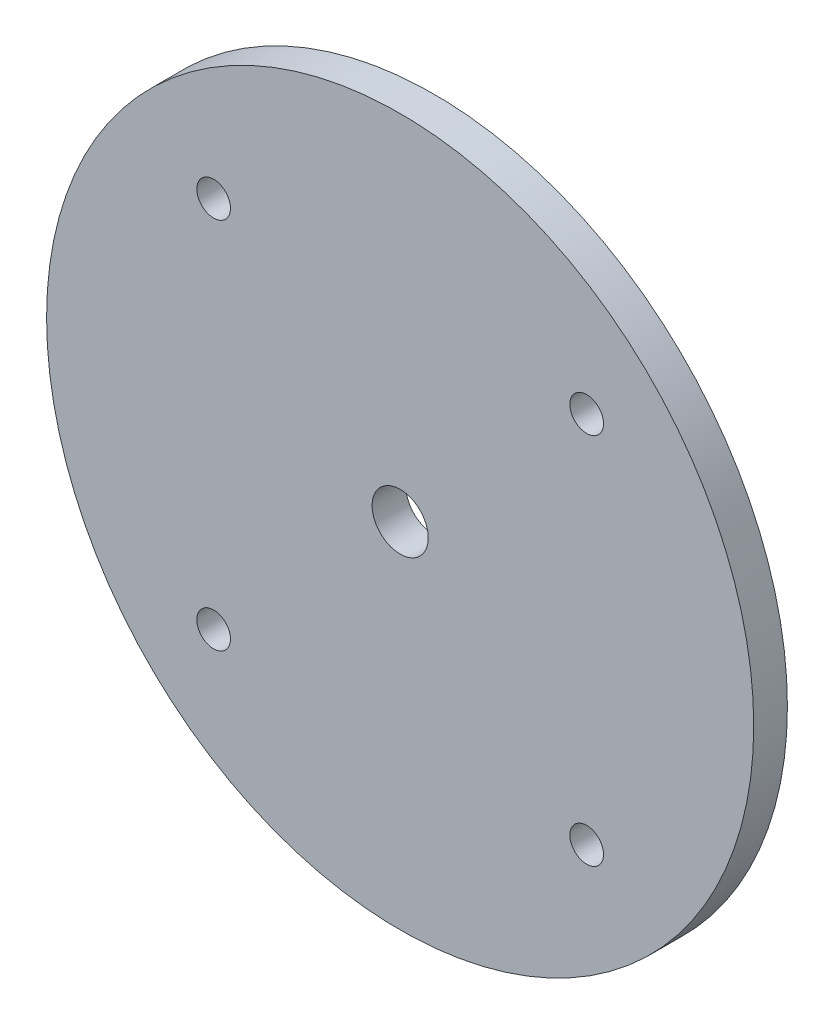
ISO-10303-21;
HEADER;
FILE_DESCRIPTION(('STEP AP214'),'2;1');
FILE_NAME('part.step','',(''),(''),'','','');
FILE_SCHEMA(('AUTOMOTIVE_DESIGN { 1 0 10303 214 1 1 1 1 }'));
ENDSEC;
DATA;
#1=APPLICATION_CONTEXT('core data for automotive mechanical design processes');
#2=APPLICATION_PROTOCOL_DEFINITION('international standard','automotive_design',2000,#1);
#3=PRODUCT_CONTEXT('',#1,'mechanical');
#4=PRODUCT('Part','Part','',(#3));
#5=PRODUCT_RELATED_PRODUCT_CATEGORY('part','',(#4));
#6=PRODUCT_DEFINITION_FORMATION('','',#4);
#7=PRODUCT_DEFINITION_CONTEXT('part definition',#1,'design');
#8=PRODUCT_DEFINITION('design','',#6,#7);
#9=PRODUCT_DEFINITION_SHAPE('','',#8);
#10=(LENGTH_UNIT() NAMED_UNIT(*) SI_UNIT(.MILLI.,.METRE.));
#11=(NAMED_UNIT(*) PLANE_ANGLE_UNIT() SI_UNIT($,.RADIAN.));
#12=(NAMED_UNIT(*) SI_UNIT($,.STERADIAN.) SOLID_ANGLE_UNIT());
#13=UNCERTAINTY_MEASURE_WITH_UNIT(LENGTH_MEASURE(1.E-05),#10,'distance_accuracy_value','');
#14=(GEOMETRIC_REPRESENTATION_CONTEXT(3) GLOBAL_UNCERTAINTY_ASSIGNED_CONTEXT((#13)) GLOBAL_UNIT_ASSIGNED_CONTEXT((#10,
#11,#12)) REPRESENTATION_CONTEXT('',''));
#15=CARTESIAN_POINT('',(0.,0.,0.));
#16=DIRECTION('',(0.,0.,1.));
#17=DIRECTION('',(1.,0.,0.));
#18=AXIS2_PLACEMENT_3D('',#15,#16,#17);
#19=CARTESIAN_POINT('',(-43.4491930476308,8.20711030882074,3.));
#20=DIRECTION('',(0.,0.,1.));
#21=DIRECTION('',(1.,0.,0.));
#22=AXIS2_PLACEMENT_3D('',#19,#20,#21);
#23=PLANE('',#22);
#24=CARTESIAN_POINT('',(-43.4491930476308,8.20711030882074,3.));
#25=DIRECTION('',(0.,0.,-1.));
#26=DIRECTION('',(-1.,0.,0.));
#27=AXIS2_PLACEMENT_3D('',#24,#25,#26);
#28=CIRCLE('',#27,2.5);
#29=CARTESIAN_POINT('',(-45.9491930476308,8.20711030882074,3.));
#30=VERTEX_POINT('',#29);
#31=EDGE_CURVE('E65',#30,#30,#28,.T.);
#32=ORIENTED_EDGE('',*,*,#31,.T.);
#33=EDGE_LOOP('',(#32));
#34=FACE_BOUND('',#33,.T.);
#35=CARTESIAN_POINT('',(-26.8321836897469,-8.40989904906317,3.));
#36=DIRECTION('',(0.,0.,1.));
#37=DIRECTION('',(1.,0.,0.));
#38=AXIS2_PLACEMENT_3D('',#35,#36,#37);
#39=CIRCLE('',#38,1.5);
#40=CARTESIAN_POINT('',(-25.3321836897469,-8.40989904906317,3.));
#41=VERTEX_POINT('',#40);
#42=EDGE_CURVE('E53',#41,#41,#39,.T.);
#43=ORIENTED_EDGE('',*,*,#42,.F.);
#44=EDGE_LOOP('',(#43));
#45=FACE_BOUND('',#44,.T.);
#46=CARTESIAN_POINT('',(-60.0662024055146,24.8241196667046,3.));
#47=DIRECTION('',(0.,0.,1.));
#48=DIRECTION('',(1.,0.,0.));
#49=AXIS2_PLACEMENT_3D('',#46,#47,#48);
#50=CIRCLE('',#49,1.5);
#51=CARTESIAN_POINT('',(-58.5662024055146,24.8241196667046,3.));
#52=VERTEX_POINT('',#51);
#53=EDGE_CURVE('E42',#52,#52,#50,.T.);
#54=ORIENTED_EDGE('',*,*,#53,.F.);
#55=EDGE_LOOP('',(#54));
#56=FACE_BOUND('',#55,.T.);
#57=CARTESIAN_POINT('',(-43.4491930476308,8.20711030882074,3.));
#58=DIRECTION('',(0.,0.,1.));
#59=DIRECTION('',(1.,0.,0.));
#60=AXIS2_PLACEMENT_3D('',#57,#58,#59);
#61=CIRCLE('',#60,31.5);
#62=CARTESIAN_POINT('',(-11.9491930476308,8.20711030882074,3.));
#63=VERTEX_POINT('',#62);
#64=EDGE_CURVE('E10',#63,#63,#61,.T.);
#65=ORIENTED_EDGE('',*,*,#64,.T.);
#66=EDGE_LOOP('',(#65));
#67=FACE_BOUND('',#66,.T.);
#68=CARTESIAN_POINT('',(-26.8321836897469,24.8241196667046,3.));
#69=DIRECTION('',(0.,0.,1.));
#70=DIRECTION('',(1.,0.,0.));
#71=AXIS2_PLACEMENT_3D('',#68,#69,#70);
#72=CIRCLE('',#71,1.5);
#73=CARTESIAN_POINT('',(-25.3321836897469,24.8241196667046,3.));
#74=VERTEX_POINT('',#73);
#75=EDGE_CURVE('E47',#74,#74,#72,.T.);
#76=ORIENTED_EDGE('',*,*,#75,.F.);
#77=EDGE_LOOP('',(#76));
#78=FACE_BOUND('',#77,.T.);
#79=CARTESIAN_POINT('',(-60.0662024055146,-8.40989904906316,3.));
#80=DIRECTION('',(0.,0.,1.));
#81=DIRECTION('',(1.,0.,0.));
#82=AXIS2_PLACEMENT_3D('',#79,#80,#81);
#83=CIRCLE('',#82,1.5);
#84=CARTESIAN_POINT('',(-58.5662024055146,-8.40989904906316,3.));
#85=VERTEX_POINT('',#84);
#86=EDGE_CURVE('E59',#85,#85,#83,.T.);
#87=ORIENTED_EDGE('',*,*,#86,.F.);
#88=EDGE_LOOP('',(#87));
#89=FACE_BOUND('',#88,.T.);
#90=ADVANCED_FACE('F31',(#34,#45,#56,#67,#78,#89),#23,.T.);
#91=CARTESIAN_POINT('',(-43.4491930476308,8.20711030882074,0.));
#92=DIRECTION('',(0.,0.,1.));
#93=DIRECTION('',(1.,0.,0.));
#94=AXIS2_PLACEMENT_3D('',#91,#92,#93);
#95=PLANE('',#94);
#96=CARTESIAN_POINT('',(-43.4491930476308,8.20711030882074,0.));
#97=DIRECTION('',(0.,0.,-1.));
#98=DIRECTION('',(-1.,0.,0.));
#99=AXIS2_PLACEMENT_3D('',#96,#97,#98);
#100=CIRCLE('',#99,2.5);
#101=CARTESIAN_POINT('',(-45.9491930476308,8.20711030882074,0.));
#102=VERTEX_POINT('',#101);
#103=EDGE_CURVE('E68',#102,#102,#100,.T.);
#104=ORIENTED_EDGE('',*,*,#103,.F.);
#105=EDGE_LOOP('',(#104));
#106=FACE_BOUND('',#105,.T.);
#107=CARTESIAN_POINT('',(-43.4491930476308,8.20711030882074,0.));
#108=DIRECTION('',(0.,0.,1.));
#109=DIRECTION('',(1.,0.,0.));
#110=AXIS2_PLACEMENT_3D('',#107,#108,#109);
#111=CIRCLE('',#110,31.5);
#112=CARTESIAN_POINT('',(-11.9491930476308,8.20711030882074,0.));
#113=VERTEX_POINT('',#112);
#114=EDGE_CURVE('E35',#113,#113,#111,.T.);
#115=ORIENTED_EDGE('',*,*,#114,.F.);
#116=EDGE_LOOP('',(#115));
#117=FACE_BOUND('',#116,.T.);
#118=CARTESIAN_POINT('',(-60.0662024055146,24.8241196667046,0.));
#119=DIRECTION('',(0.,0.,1.));
#120=DIRECTION('',(1.,0.,0.));
#121=AXIS2_PLACEMENT_3D('',#118,#119,#120);
#122=CIRCLE('',#121,1.5);
#123=CARTESIAN_POINT('',(-58.5662024055146,24.8241196667046,0.));
#124=VERTEX_POINT('',#123);
#125=EDGE_CURVE('E44',#124,#124,#122,.T.);
#126=ORIENTED_EDGE('',*,*,#125,.T.);
#127=EDGE_LOOP('',(#126));
#128=FACE_BOUND('',#127,.T.);
#129=CARTESIAN_POINT('',(-26.8321836897469,24.8241196667046,0.));
#130=DIRECTION('',(0.,0.,1.));
#131=DIRECTION('',(1.,0.,0.));
#132=AXIS2_PLACEMENT_3D('',#129,#130,#131);
#133=CIRCLE('',#132,1.5);
#134=CARTESIAN_POINT('',(-25.3321836897469,24.8241196667046,0.));
#135=VERTEX_POINT('',#134);
#136=EDGE_CURVE('E50',#135,#135,#133,.T.);
#137=ORIENTED_EDGE('',*,*,#136,.T.);
#138=EDGE_LOOP('',(#137));
#139=FACE_BOUND('',#138,.T.);
#140=CARTESIAN_POINT('',(-26.8321836897469,-8.40989904906317,0.));
#141=DIRECTION('',(0.,0.,1.));
#142=DIRECTION('',(1.,0.,0.));
#143=AXIS2_PLACEMENT_3D('',#140,#141,#142);
#144=CIRCLE('',#143,1.5);
#145=CARTESIAN_POINT('',(-25.3321836897469,-8.40989904906317,0.));
#146=VERTEX_POINT('',#145);
#147=EDGE_CURVE('E56',#146,#146,#144,.T.);
#148=ORIENTED_EDGE('',*,*,#147,.T.);
#149=EDGE_LOOP('',(#148));
#150=FACE_BOUND('',#149,.T.);
#151=CARTESIAN_POINT('',(-60.0662024055146,-8.40989904906316,0.));
#152=DIRECTION('',(0.,0.,1.));
#153=DIRECTION('',(1.,0.,0.));
#154=AXIS2_PLACEMENT_3D('',#151,#152,#153);
#155=CIRCLE('',#154,1.5);
#156=CARTESIAN_POINT('',(-58.5662024055146,-8.40989904906316,0.));
#157=VERTEX_POINT('',#156);
#158=EDGE_CURVE('E62',#157,#157,#155,.T.);
#159=ORIENTED_EDGE('',*,*,#158,.T.);
#160=EDGE_LOOP('',(#159));
#161=FACE_BOUND('',#160,.T.);
#162=ADVANCED_FACE('F83',(#106,#117,#128,#139,#150,#161),#95,.F.);
#163=CARTESIAN_POINT('',(-43.4491930476308,8.20711030882074,3.));
#164=DIRECTION('',(0.,0.,-1.));
#165=DIRECTION('',(-1.,0.,0.));
#166=AXIS2_PLACEMENT_3D('',#163,#164,#165);
#167=CYLINDRICAL_SURFACE('',#166,31.5);
#168=ORIENTED_EDGE('',*,*,#64,.F.);
#169=EDGE_LOOP('',(#168));
#170=FACE_BOUND('',#169,.T.);
#171=ORIENTED_EDGE('',*,*,#114,.T.);
#172=EDGE_LOOP('',(#171));
#173=FACE_BOUND('',#172,.T.);
#174=ADVANCED_FACE('F33',(#170,#173),#167,.T.);
#175=CARTESIAN_POINT('',(-60.0662024055146,24.8241196667046,3.));
#176=DIRECTION('',(0.,0.,-1.));
#177=DIRECTION('',(-1.,0.,0.));
#178=AXIS2_PLACEMENT_3D('',#175,#176,#177);
#179=CYLINDRICAL_SURFACE('',#178,1.5);
#180=ORIENTED_EDGE('',*,*,#53,.T.);
#181=EDGE_LOOP('',(#180));
#182=FACE_BOUND('',#181,.T.);
#183=ORIENTED_EDGE('',*,*,#125,.F.);
#184=EDGE_LOOP('',(#183));
#185=FACE_BOUND('',#184,.T.);
#186=ADVANCED_FACE('F111',(#182,#185),#179,.F.);
#187=CARTESIAN_POINT('',(-26.8321836897469,24.8241196667046,3.));
#188=DIRECTION('',(0.,0.,-1.));
#189=DIRECTION('',(-1.,0.,0.));
#190=AXIS2_PLACEMENT_3D('',#187,#188,#189);
#191=CYLINDRICAL_SURFACE('',#190,1.5);
#192=ORIENTED_EDGE('',*,*,#75,.T.);
#193=EDGE_LOOP('',(#192));
#194=FACE_BOUND('',#193,.T.);
#195=ORIENTED_EDGE('',*,*,#136,.F.);
#196=EDGE_LOOP('',(#195));
#197=FACE_BOUND('',#196,.T.);
#198=ADVANCED_FACE('F103',(#194,#197),#191,.F.);
#199=CARTESIAN_POINT('',(-26.8321836897469,-8.40989904906317,3.));
#200=DIRECTION('',(0.,0.,-1.));
#201=DIRECTION('',(-1.,0.,0.));
#202=AXIS2_PLACEMENT_3D('',#199,#200,#201);
#203=CYLINDRICAL_SURFACE('',#202,1.5);
#204=ORIENTED_EDGE('',*,*,#42,.T.);
#205=EDGE_LOOP('',(#204));
#206=FACE_BOUND('',#205,.T.);
#207=ORIENTED_EDGE('',*,*,#147,.F.);
#208=EDGE_LOOP('',(#207));
#209=FACE_BOUND('',#208,.T.);
#210=ADVANCED_FACE('F97',(#206,#209),#203,.F.);
#211=CARTESIAN_POINT('',(-60.0662024055146,-8.40989904906316,3.));
#212=DIRECTION('',(0.,0.,-1.));
#213=DIRECTION('',(-1.,0.,0.));
#214=AXIS2_PLACEMENT_3D('',#211,#212,#213);
#215=CYLINDRICAL_SURFACE('',#214,1.5);
#216=ORIENTED_EDGE('',*,*,#86,.T.);
#217=EDGE_LOOP('',(#216));
#218=FACE_BOUND('',#217,.T.);
#219=ORIENTED_EDGE('',*,*,#158,.F.);
#220=EDGE_LOOP('',(#219));
#221=FACE_BOUND('',#220,.T.);
#222=ADVANCED_FACE('F79',(#218,#221),#215,.F.);
#223=CARTESIAN_POINT('',(-43.4491930476308,8.20711030882074,3.));
#224=DIRECTION('',(0.,0.,-1.));
#225=DIRECTION('',(-1.,0.,0.));
#226=AXIS2_PLACEMENT_3D('',#223,#224,#225);
#227=CYLINDRICAL_SURFACE('',#226,2.5);
#228=ORIENTED_EDGE('',*,*,#31,.F.);
#229=EDGE_LOOP('',(#228));
#230=FACE_BOUND('',#229,.T.);
#231=ORIENTED_EDGE('',*,*,#103,.T.);
#232=EDGE_LOOP('',(#231));
#233=FACE_BOUND('',#232,.T.);
#234=ADVANCED_FACE('F76',(#230,#233),#227,.F.);
#235=CLOSED_SHELL('',(#90,#162,#174,#186,#198,#210,#222,#234));
#236=MANIFOLD_SOLID_BREP('B2',#235);
#237=ADVANCED_BREP_SHAPE_REPRESENTATION('',(#18,#236),#14);
#238=SHAPE_DEFINITION_REPRESENTATION(#9,#237);
ENDSEC;
END-ISO-10303-21;
